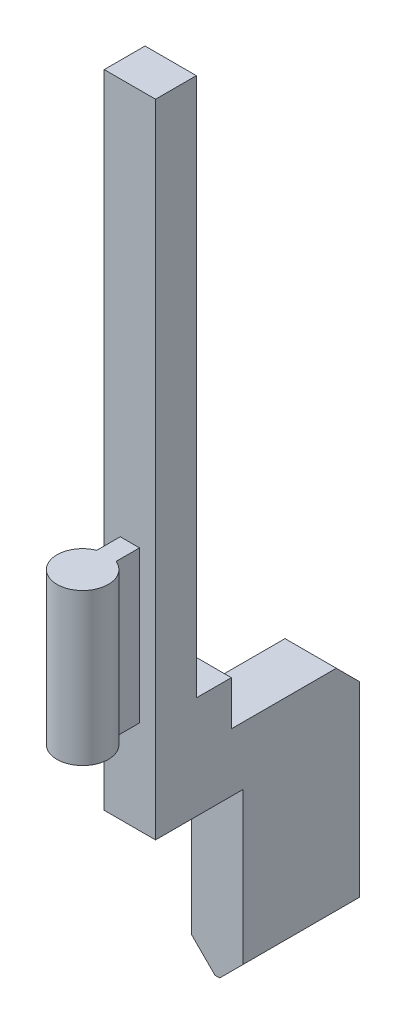
ISO-10303-21;
HEADER;
FILE_DESCRIPTION(('STEP AP214'),'2;1');
FILE_NAME('part.step','',(''),(''),'','','');
FILE_SCHEMA(('AUTOMOTIVE_DESIGN { 1 0 10303 214 1 1 1 1 }'));
ENDSEC;
DATA;
#1=APPLICATION_CONTEXT('core data for automotive mechanical design processes');
#2=APPLICATION_PROTOCOL_DEFINITION('international standard','automotive_design',2000,#1);
#3=PRODUCT_CONTEXT('',#1,'mechanical');
#4=PRODUCT('Part','Part','',(#3));
#5=PRODUCT_RELATED_PRODUCT_CATEGORY('part','',(#4));
#6=PRODUCT_DEFINITION_FORMATION('','',#4);
#7=PRODUCT_DEFINITION_CONTEXT('part definition',#1,'design');
#8=PRODUCT_DEFINITION('design','',#6,#7);
#9=PRODUCT_DEFINITION_SHAPE('','',#8);
#10=(LENGTH_UNIT() NAMED_UNIT(*) SI_UNIT(.MILLI.,.METRE.));
#11=(NAMED_UNIT(*) PLANE_ANGLE_UNIT() SI_UNIT($,.RADIAN.));
#12=(NAMED_UNIT(*) SI_UNIT($,.STERADIAN.) SOLID_ANGLE_UNIT());
#13=UNCERTAINTY_MEASURE_WITH_UNIT(LENGTH_MEASURE(1.E-05),#10,'distance_accuracy_value','');
#14=(GEOMETRIC_REPRESENTATION_CONTEXT(3) GLOBAL_UNCERTAINTY_ASSIGNED_CONTEXT((#13)) GLOBAL_UNIT_ASSIGNED_CONTEXT((#10,
#11,#12)) REPRESENTATION_CONTEXT('',''));
#15=CARTESIAN_POINT('',(0.,0.,0.));
#16=DIRECTION('',(0.,0.,1.));
#17=DIRECTION('',(1.,0.,0.));
#18=AXIS2_PLACEMENT_3D('',#15,#16,#17);
#19=CARTESIAN_POINT('',(-2.2,10.5,6.5));
#20=DIRECTION('',(0.,-1.,0.));
#21=DIRECTION('',(0.,0.,-1.));
#22=AXIS2_PLACEMENT_3D('',#19,#20,#21);
#23=PLANE('',#22);
#24=DIRECTION('',(1.,0.,0.));
#25=VECTOR('',#24,1.);
#26=CARTESIAN_POINT('',(-2.2,10.5,6.5));
#27=LINE('',#26,#25);
#28=CARTESIAN_POINT('',(-0.825000000000007,10.5,6.5));
#29=VERTEX_POINT('',#28);
#30=CARTESIAN_POINT('',(0.825,10.5,6.5));
#31=VERTEX_POINT('',#30);
#32=EDGE_CURVE('E11',#29,#31,#27,.T.);
#33=ORIENTED_EDGE('',*,*,#32,.F.);
#34=DIRECTION('',(0.,0.,1.));
#35=VECTOR('',#34,1.);
#36=CARTESIAN_POINT('',(-0.825000000000032,10.5,0.));
#37=LINE('',#36,#35);
#38=CARTESIAN_POINT('',(-0.824999999999999,10.5,8.5105454160487));
#39=VERTEX_POINT('',#38);
#40=EDGE_CURVE('E240',#29,#39,#37,.T.);
#41=ORIENTED_EDGE('',*,*,#40,.T.);
#42=CARTESIAN_POINT('',(0.,10.5,10.55));
#43=DIRECTION('',(0.,1.,0.));
#44=DIRECTION('',(0.,0.,1.));
#45=AXIS2_PLACEMENT_3D('',#42,#43,#44);
#46=CIRCLE('',#45,2.19999999999999);
#47=CARTESIAN_POINT('',(0.825,10.5,8.51054541604871));
#48=VERTEX_POINT('',#47);
#49=EDGE_CURVE('E235',#39,#48,#46,.T.);
#50=ORIENTED_EDGE('',*,*,#49,.T.);
#51=DIRECTION('',(0.,0.,1.));
#52=VECTOR('',#51,1.);
#53=CARTESIAN_POINT('',(0.824999999999969,10.5,0.));
#54=LINE('',#53,#52);
#55=EDGE_CURVE('E250',#31,#48,#54,.T.);
#56=ORIENTED_EDGE('',*,*,#55,.F.);
#57=EDGE_LOOP('',(#33,#41,#50,#56));
#58=FACE_BOUND('',#57,.T.);
#59=ADVANCED_FACE('F43',(#58),#23,.F.);
#60=CARTESIAN_POINT('',(0.,0.,0.));
#61=DIRECTION('',(0.,0.,1.));
#62=DIRECTION('',(1.,0.,0.));
#63=AXIS2_PLACEMENT_3D('',#60,#61,#62);
#64=PLANE('',#63);
#65=DIRECTION('',(-1.,0.,0.));
#66=VECTOR('',#65,1.);
#67=CARTESIAN_POINT('',(-2.2,-1.7,0.));
#68=LINE('',#67,#66);
#69=CARTESIAN_POINT('',(2.2,-1.7,0.));
#70=VERTEX_POINT('',#69);
#71=CARTESIAN_POINT('',(-2.2,-1.69999999999999,0.));
#72=VERTEX_POINT('',#71);
#73=EDGE_CURVE('E60',#70,#72,#68,.T.);
#74=ORIENTED_EDGE('',*,*,#73,.F.);
#75=DIRECTION('',(0.,1.,0.));
#76=VECTOR('',#75,1.);
#77=CARTESIAN_POINT('',(2.2,10.5,0.));
#78=LINE('',#77,#76);
#79=CARTESIAN_POINT('',(2.2,-5.5,0.));
#80=VERTEX_POINT('',#79);
#81=EDGE_CURVE('E257',#80,#70,#78,.T.);
#82=ORIENTED_EDGE('',*,*,#81,.F.);
#83=DIRECTION('',(1.,0.,0.));
#84=VECTOR('',#83,1.);
#85=CARTESIAN_POINT('',(2.2,-5.5,0.));
#86=LINE('',#85,#84);
#87=CARTESIAN_POINT('',(-2.2,-5.49999999999999,0.));
#88=VERTEX_POINT('',#87);
#89=EDGE_CURVE('E221',#88,#80,#86,.T.);
#90=ORIENTED_EDGE('',*,*,#89,.F.);
#91=DIRECTION('',(0.,-1.,0.));
#92=VECTOR('',#91,1.);
#93=CARTESIAN_POINT('',(-2.2,10.5,0.));
#94=LINE('',#93,#92);
#95=EDGE_CURVE('E265',#72,#88,#94,.T.);
#96=ORIENTED_EDGE('',*,*,#95,.F.);
#97=EDGE_LOOP('',(#74,#82,#90,#96));
#98=FACE_BOUND('',#97,.T.);
#99=ADVANCED_FACE('F332',(#98),#64,.F.);
#100=CARTESIAN_POINT('',(-2.2,-10.5,6.5));
#101=DIRECTION('',(0.,1.,0.));
#102=DIRECTION('',(0.,0.,1.));
#103=AXIS2_PLACEMENT_3D('',#100,#101,#102);
#104=PLANE('',#103);
#105=DIRECTION('',(-1.,0.,0.));
#106=VECTOR('',#105,1.);
#107=CARTESIAN_POINT('',(2.2,-10.5,-1.));
#108=LINE('',#107,#106);
#109=CARTESIAN_POINT('',(2.2,-10.5,-0.999999999999998));
#110=VERTEX_POINT('',#109);
#111=CARTESIAN_POINT('',(-2.2,-10.5,-1.));
#112=VERTEX_POINT('',#111);
#113=EDGE_CURVE('E208',#110,#112,#108,.T.);
#114=ORIENTED_EDGE('',*,*,#113,.F.);
#115=DIRECTION('',(0.,0.,-1.));
#116=VECTOR('',#115,1.);
#117=CARTESIAN_POINT('',(2.2,-10.5,6.5));
#118=LINE('',#117,#116);
#119=CARTESIAN_POINT('',(2.2,-10.5,6.5));
#120=VERTEX_POINT('',#119);
#121=EDGE_CURVE('E268',#120,#110,#118,.T.);
#122=ORIENTED_EDGE('',*,*,#121,.F.);
#123=DIRECTION('',(1.,0.,0.));
#124=VECTOR('',#123,1.);
#125=CARTESIAN_POINT('',(-2.2,-10.5,6.5));
#126=LINE('',#125,#124);
#127=CARTESIAN_POINT('',(-2.2,-10.5,6.5));
#128=VERTEX_POINT('',#127);
#129=EDGE_CURVE('E176',#128,#120,#126,.T.);
#130=ORIENTED_EDGE('',*,*,#129,.F.);
#131=DIRECTION('',(0.,0.,-1.));
#132=VECTOR('',#131,1.);
#133=CARTESIAN_POINT('',(-2.2,-10.5,6.5));
#134=LINE('',#133,#132);
#135=EDGE_CURVE('E173',#128,#112,#134,.T.);
#136=ORIENTED_EDGE('',*,*,#135,.T.);
#137=EDGE_LOOP('',(#114,#122,#130,#136));
#138=FACE_BOUND('',#137,.T.);
#139=ADVANCED_FACE('F353',(#138),#104,.F.);
#140=CARTESIAN_POINT('',(2.2,10.5,6.5));
#141=DIRECTION('',(-1.,0.,0.));
#142=DIRECTION('',(0.,-1.,0.));
#143=AXIS2_PLACEMENT_3D('',#140,#141,#142);
#144=PLANE('',#143);
#145=DIRECTION('',(0.,0.,-1.));
#146=VECTOR('',#145,1.);
#147=CARTESIAN_POINT('',(2.2,-1.7,0.));
#148=LINE('',#147,#146);
#149=CARTESIAN_POINT('',(2.2,-1.7,3.));
#150=VERTEX_POINT('',#149);
#151=EDGE_CURVE('E202',#150,#70,#148,.T.);
#152=ORIENTED_EDGE('',*,*,#151,.F.);
#153=DIRECTION('',(0.,1.,0.));
#154=VECTOR('',#153,1.);
#155=CARTESIAN_POINT('',(2.2,-1.7,3.));
#156=LINE('',#155,#154);
#157=CARTESIAN_POINT('',(2.2,44.5,3.));
#158=VERTEX_POINT('',#157);
#159=EDGE_CURVE('E206',#150,#158,#156,.T.);
#160=ORIENTED_EDGE('',*,*,#159,.T.);
#161=DIRECTION('',(0.,0.,-1.));
#162=VECTOR('',#161,1.);
#163=CARTESIAN_POINT('',(2.2,44.5,3.));
#164=LINE('',#163,#162);
#165=CARTESIAN_POINT('',(2.2,44.5,6.5));
#166=VERTEX_POINT('',#165);
#167=EDGE_CURVE('E187',#166,#158,#164,.T.);
#168=ORIENTED_EDGE('',*,*,#167,.F.);
#169=DIRECTION('',(0.,1.,0.));
#170=VECTOR('',#169,1.);
#171=CARTESIAN_POINT('',(2.2,10.5,6.5));
#172=LINE('',#171,#170);
#173=EDGE_CURVE('E177',#120,#166,#172,.T.);
#174=ORIENTED_EDGE('',*,*,#173,.F.);
#175=ORIENTED_EDGE('',*,*,#121,.T.);
#176=DIRECTION('',(0.,1.,0.));
#177=VECTOR('',#176,1.);
#178=CARTESIAN_POINT('',(2.2,-25.5,-1.));
#179=LINE('',#178,#177);
#180=CARTESIAN_POINT('',(2.2,-23.5,-1.));
#181=VERTEX_POINT('',#180);
#182=EDGE_CURVE('E219',#181,#110,#179,.T.);
#183=ORIENTED_EDGE('',*,*,#182,.F.);
#184=DIRECTION('',(0.,0.,-1.));
#185=VECTOR('',#184,1.);
#186=CARTESIAN_POINT('',(2.2,-23.5,-11.));
#187=LINE('',#186,#185);
#188=CARTESIAN_POINT('',(2.2,-23.5,-11.));
#189=VERTEX_POINT('',#188);
#190=EDGE_CURVE('E282',#181,#189,#187,.T.);
#191=ORIENTED_EDGE('',*,*,#190,.T.);
#192=DIRECTION('',(0.,-1.,0.));
#193=VECTOR('',#192,1.);
#194=CARTESIAN_POINT('',(2.2,-5.5,-11.));
#195=LINE('',#194,#193);
#196=CARTESIAN_POINT('',(2.2,-7.5,-11.));
#197=VERTEX_POINT('',#196);
#198=EDGE_CURVE('E222',#197,#189,#195,.T.);
#199=ORIENTED_EDGE('',*,*,#198,.F.);
#200=DIRECTION('',(0.,0.707106781186546,0.707106781186549));
#201=VECTOR('',#200,1.);
#202=CARTESIAN_POINT('',(2.2,-7.5,-11.));
#203=LINE('',#202,#201);
#204=CARTESIAN_POINT('',(2.2,-5.5,-8.99999999999999));
#205=VERTEX_POINT('',#204);
#206=EDGE_CURVE('E284',#197,#205,#203,.T.);
#207=ORIENTED_EDGE('',*,*,#206,.T.);
#208=DIRECTION('',(0.,0.,1.));
#209=VECTOR('',#208,1.);
#210=CARTESIAN_POINT('',(2.2,-5.5,-11.));
#211=LINE('',#210,#209);
#212=EDGE_CURVE('E228',#205,#80,#211,.T.);
#213=ORIENTED_EDGE('',*,*,#212,.T.);
#214=ORIENTED_EDGE('',*,*,#81,.T.);
#215=EDGE_LOOP('',(#152,#160,#168,#174,#175,#183,#191,#199,#207,#213,#214));
#216=FACE_BOUND('',#215,.T.);
#217=ADVANCED_FACE('F305',(#216),#144,.F.);
#218=CARTESIAN_POINT('',(-2.2,10.5,6.5));
#219=DIRECTION('',(1.,0.,0.));
#220=DIRECTION('',(0.,1.,0.));
#221=AXIS2_PLACEMENT_3D('',#218,#219,#220);
#222=PLANE('',#221);
#223=DIRECTION('',(0.,-1.,0.));
#224=VECTOR('',#223,1.);
#225=CARTESIAN_POINT('',(-2.2,10.5,6.5));
#226=LINE('',#225,#224);
#227=CARTESIAN_POINT('',(-2.2,44.5,6.5));
#228=VERTEX_POINT('',#227);
#229=EDGE_CURVE('E166',#228,#128,#226,.T.);
#230=ORIENTED_EDGE('',*,*,#229,.F.);
#231=DIRECTION('',(0.,0.,1.));
#232=VECTOR('',#231,1.);
#233=CARTESIAN_POINT('',(-2.2,44.5,3.));
#234=LINE('',#233,#232);
#235=CARTESIAN_POINT('',(-2.2,44.5,3.));
#236=VERTEX_POINT('',#235);
#237=EDGE_CURVE('E171',#236,#228,#234,.T.);
#238=ORIENTED_EDGE('',*,*,#237,.F.);
#239=DIRECTION('',(0.,1.,0.));
#240=VECTOR('',#239,1.);
#241=CARTESIAN_POINT('',(-2.2,-1.7,3.));
#242=LINE('',#241,#240);
#243=CARTESIAN_POINT('',(-2.2,-1.7,3.));
#244=VERTEX_POINT('',#243);
#245=EDGE_CURVE('E205',#244,#236,#242,.T.);
#246=ORIENTED_EDGE('',*,*,#245,.F.);
#247=DIRECTION('',(0.,0.,1.));
#248=VECTOR('',#247,1.);
#249=CARTESIAN_POINT('',(-2.2,-1.7,0.));
#250=LINE('',#249,#248);
#251=EDGE_CURVE('E196',#72,#244,#250,.T.);
#252=ORIENTED_EDGE('',*,*,#251,.F.);
#253=ORIENTED_EDGE('',*,*,#95,.T.);
#254=DIRECTION('',(0.,0.,1.));
#255=VECTOR('',#254,1.);
#256=CARTESIAN_POINT('',(-2.2,-5.5,-11.));
#257=LINE('',#256,#255);
#258=CARTESIAN_POINT('',(-2.2,-5.5,-8.99999999999999));
#259=VERTEX_POINT('',#258);
#260=EDGE_CURVE('E232',#259,#88,#257,.T.);
#261=ORIENTED_EDGE('',*,*,#260,.F.);
#262=DIRECTION('',(0.,-0.707106781186546,-0.707106781186549));
#263=VECTOR('',#262,1.);
#264=CARTESIAN_POINT('',(-2.2,-7.5,-11.));
#265=LINE('',#264,#263);
#266=CARTESIAN_POINT('',(-2.2,-7.5,-11.));
#267=VERTEX_POINT('',#266);
#268=EDGE_CURVE('E290',#259,#267,#265,.T.);
#269=ORIENTED_EDGE('',*,*,#268,.T.);
#270=DIRECTION('',(0.,1.,0.));
#271=VECTOR('',#270,1.);
#272=CARTESIAN_POINT('',(-2.2,-5.5,-11.));
#273=LINE('',#272,#271);
#274=CARTESIAN_POINT('',(-2.2,-23.5,-11.));
#275=VERTEX_POINT('',#274);
#276=EDGE_CURVE('E225',#275,#267,#273,.T.);
#277=ORIENTED_EDGE('',*,*,#276,.F.);
#278=DIRECTION('',(0.,0.,1.));
#279=VECTOR('',#278,1.);
#280=CARTESIAN_POINT('',(-2.2,-23.5,-1.));
#281=LINE('',#280,#279);
#282=CARTESIAN_POINT('',(-2.2,-23.5,-1.));
#283=VERTEX_POINT('',#282);
#284=EDGE_CURVE('E288',#275,#283,#281,.T.);
#285=ORIENTED_EDGE('',*,*,#284,.T.);
#286=DIRECTION('',(0.,1.,0.));
#287=VECTOR('',#286,1.);
#288=CARTESIAN_POINT('',(-2.2,-25.5,-1.));
#289=LINE('',#288,#287);
#290=EDGE_CURVE('E215',#283,#112,#289,.T.);
#291=ORIENTED_EDGE('',*,*,#290,.T.);
#292=ORIENTED_EDGE('',*,*,#135,.F.);
#293=EDGE_LOOP('',(#230,#238,#246,#252,#253,#261,#269,#277,#285,#291,#292));
#294=FACE_BOUND('',#293,.T.);
#295=ADVANCED_FACE('F168',(#294),#222,.F.);
#296=CARTESIAN_POINT('',(0.,0.,6.5));
#297=DIRECTION('',(0.,0.,1.));
#298=DIRECTION('',(1.,0.,0.));
#299=AXIS2_PLACEMENT_3D('',#296,#297,#298);
#300=PLANE('',#299);
#301=DIRECTION('',(1.,0.,0.));
#302=VECTOR('',#301,1.);
#303=CARTESIAN_POINT('',(-2.2,44.5,6.5));
#304=LINE('',#303,#302);
#305=EDGE_CURVE('E180',#228,#166,#304,.T.);
#306=ORIENTED_EDGE('',*,*,#305,.F.);
#307=ORIENTED_EDGE('',*,*,#229,.T.);
#308=ORIENTED_EDGE('',*,*,#129,.T.);
#309=ORIENTED_EDGE('',*,*,#173,.T.);
#310=EDGE_LOOP('',(#306,#307,#308,#309));
#311=FACE_BOUND('',#310,.T.);
#312=DIRECTION('',(0.,1.,0.));
#313=VECTOR('',#312,1.);
#314=CARTESIAN_POINT('',(0.825,-2.5,6.5));
#315=LINE('',#314,#313);
#316=CARTESIAN_POINT('',(0.825,-2.5,6.5));
#317=VERTEX_POINT('',#316);
#318=EDGE_CURVE('E261',#317,#31,#315,.T.);
#319=ORIENTED_EDGE('',*,*,#318,.F.);
#320=DIRECTION('',(1.,0.,0.));
#321=VECTOR('',#320,1.);
#322=CARTESIAN_POINT('',(0.,-2.5,6.5));
#323=LINE('',#322,#321);
#324=CARTESIAN_POINT('',(-0.825000000000007,-2.5,6.5));
#325=VERTEX_POINT('',#324);
#326=EDGE_CURVE('E242',#325,#317,#323,.T.);
#327=ORIENTED_EDGE('',*,*,#326,.F.);
#328=DIRECTION('',(0.,1.,0.));
#329=VECTOR('',#328,1.);
#330=CARTESIAN_POINT('',(-0.825000000000007,-2.5,6.5));
#331=LINE('',#330,#329);
#332=EDGE_CURVE('E258',#325,#29,#331,.T.);
#333=ORIENTED_EDGE('',*,*,#332,.T.);
#334=ORIENTED_EDGE('',*,*,#32,.T.);
#335=EDGE_LOOP('',(#319,#327,#333,#334));
#336=FACE_BOUND('',#335,.T.);
#337=ADVANCED_FACE('F181',(#311,#336),#300,.T.);
#338=CARTESIAN_POINT('',(0.,-2.5,10.55));
#339=DIRECTION('',(0.,1.,0.));
#340=DIRECTION('',(0.,0.,1.));
#341=AXIS2_PLACEMENT_3D('',#338,#339,#340);
#342=CYLINDRICAL_SURFACE('',#341,2.19999999999999);
#343=ORIENTED_EDGE('',*,*,#49,.F.);
#344=DIRECTION('',(0.,1.,0.));
#345=VECTOR('',#344,1.);
#346=CARTESIAN_POINT('',(-0.824999999999999,-2.5,8.5105454160487));
#347=LINE('',#346,#345);
#348=CARTESIAN_POINT('',(-0.824999999999999,-2.5,8.5105454160487));
#349=VERTEX_POINT('',#348);
#350=EDGE_CURVE('E255',#349,#39,#347,.T.);
#351=ORIENTED_EDGE('',*,*,#350,.F.);
#352=CARTESIAN_POINT('',(0.,-2.5,10.55));
#353=DIRECTION('',(0.,1.,0.));
#354=DIRECTION('',(0.,0.,1.));
#355=AXIS2_PLACEMENT_3D('',#352,#353,#354);
#356=CIRCLE('',#355,2.19999999999999);
#357=CARTESIAN_POINT('',(0.825,-2.5,8.51054541604871));
#358=VERTEX_POINT('',#357);
#359=EDGE_CURVE('E236',#349,#358,#356,.T.);
#360=ORIENTED_EDGE('',*,*,#359,.T.);
#361=DIRECTION('',(0.,1.,0.));
#362=VECTOR('',#361,1.);
#363=CARTESIAN_POINT('',(0.825,-2.5,8.51054541604871));
#364=LINE('',#363,#362);
#365=EDGE_CURVE('E247',#358,#48,#364,.T.);
#366=ORIENTED_EDGE('',*,*,#365,.T.);
#367=EDGE_LOOP('',(#343,#351,#360,#366));
#368=FACE_BOUND('',#367,.T.);
#369=ADVANCED_FACE('F430',(#368),#342,.T.);
#370=CARTESIAN_POINT('',(-0.825000000000032,-2.5,0.));
#371=DIRECTION('',(-1.,0.,0.));
#372=DIRECTION('',(0.,0.,1.));
#373=AXIS2_PLACEMENT_3D('',#370,#371,#372);
#374=PLANE('',#373);
#375=ORIENTED_EDGE('',*,*,#40,.F.);
#376=ORIENTED_EDGE('',*,*,#332,.F.);
#377=DIRECTION('',(0.,0.,1.));
#378=VECTOR('',#377,1.);
#379=CARTESIAN_POINT('',(-0.825000000000032,-2.5,0.));
#380=LINE('',#379,#378);
#381=EDGE_CURVE('E244',#325,#349,#380,.T.);
#382=ORIENTED_EDGE('',*,*,#381,.T.);
#383=ORIENTED_EDGE('',*,*,#350,.T.);
#384=EDGE_LOOP('',(#375,#376,#382,#383));
#385=FACE_BOUND('',#384,.T.);
#386=ADVANCED_FACE('F447',(#385),#374,.T.);
#387=CARTESIAN_POINT('',(0.824999999999969,-2.5,0.));
#388=DIRECTION('',(-1.,0.,0.));
#389=DIRECTION('',(0.,0.,1.));
#390=AXIS2_PLACEMENT_3D('',#387,#388,#389);
#391=PLANE('',#390);
#392=ORIENTED_EDGE('',*,*,#55,.T.);
#393=ORIENTED_EDGE('',*,*,#365,.F.);
#394=DIRECTION('',(0.,0.,1.));
#395=VECTOR('',#394,1.);
#396=CARTESIAN_POINT('',(0.824999999999969,-2.5,0.));
#397=LINE('',#396,#395);
#398=EDGE_CURVE('E239',#317,#358,#397,.T.);
#399=ORIENTED_EDGE('',*,*,#398,.F.);
#400=ORIENTED_EDGE('',*,*,#318,.T.);
#401=EDGE_LOOP('',(#392,#393,#399,#400));
#402=FACE_BOUND('',#401,.T.);
#403=ADVANCED_FACE('F450',(#402),#391,.F.);
#404=CARTESIAN_POINT('',(0.,-2.5,0.));
#405=DIRECTION('',(0.,1.,0.));
#406=DIRECTION('',(0.,0.,1.));
#407=AXIS2_PLACEMENT_3D('',#404,#405,#406);
#408=PLANE('',#407);
#409=ORIENTED_EDGE('',*,*,#359,.F.);
#410=ORIENTED_EDGE('',*,*,#381,.F.);
#411=ORIENTED_EDGE('',*,*,#326,.T.);
#412=ORIENTED_EDGE('',*,*,#398,.T.);
#413=EDGE_LOOP('',(#409,#410,#411,#412));
#414=FACE_BOUND('',#413,.T.);
#415=ADVANCED_FACE('F458',(#414),#408,.F.);
#416=CARTESIAN_POINT('',(2.2,-5.5,-11.));
#417=DIRECTION('',(0.,-1.,0.));
#418=DIRECTION('',(0.,0.,-1.));
#419=AXIS2_PLACEMENT_3D('',#416,#417,#418);
#420=PLANE('',#419);
#421=ORIENTED_EDGE('',*,*,#212,.F.);
#422=DIRECTION('',(-1.,0.,0.));
#423=VECTOR('',#422,1.);
#424=CARTESIAN_POINT('',(-2.2,-5.5,-8.99999999999999));
#425=LINE('',#424,#423);
#426=EDGE_CURVE('E286',#205,#259,#425,.T.);
#427=ORIENTED_EDGE('',*,*,#426,.T.);
#428=ORIENTED_EDGE('',*,*,#260,.T.);
#429=ORIENTED_EDGE('',*,*,#89,.T.);
#430=EDGE_LOOP('',(#421,#427,#428,#429));
#431=FACE_BOUND('',#430,.T.);
#432=ADVANCED_FACE('F328',(#431),#420,.F.);
#433=CARTESIAN_POINT('',(0.,0.,-11.));
#434=DIRECTION('',(0.,0.,-1.));
#435=DIRECTION('',(-1.,0.,0.));
#436=AXIS2_PLACEMENT_3D('',#433,#434,#435);
#437=PLANE('',#436);
#438=ORIENTED_EDGE('',*,*,#276,.T.);
#439=DIRECTION('',(1.,0.,0.));
#440=VECTOR('',#439,1.);
#441=CARTESIAN_POINT('',(2.2,-7.5,-11.));
#442=LINE('',#441,#440);
#443=EDGE_CURVE('E279',#267,#197,#442,.T.);
#444=ORIENTED_EDGE('',*,*,#443,.T.);
#445=ORIENTED_EDGE('',*,*,#198,.T.);
#446=DIRECTION('',(-0.707106781186546,-0.707106781186549,0.));
#447=VECTOR('',#446,1.);
#448=CARTESIAN_POINT('',(12.85,-12.8499999999999,-11.));
#449=LINE('',#448,#447);
#450=CARTESIAN_POINT('',(0.200000000000008,-25.5,-11.));
#451=VERTEX_POINT('',#450);
#452=EDGE_CURVE('E277',#189,#451,#449,.T.);
#453=ORIENTED_EDGE('',*,*,#452,.T.);
#454=DIRECTION('',(1.,0.,0.));
#455=VECTOR('',#454,1.);
#456=CARTESIAN_POINT('',(2.2,-25.5,-11.));
#457=LINE('',#456,#455);
#458=CARTESIAN_POINT('',(-0.200000000000006,-25.5,-11.));
#459=VERTEX_POINT('',#458);
#460=EDGE_CURVE('E212',#459,#451,#457,.T.);
#461=ORIENTED_EDGE('',*,*,#460,.F.);
#462=DIRECTION('',(-0.707106781186546,0.707106781186549,0.));
#463=VECTOR('',#462,1.);
#464=CARTESIAN_POINT('',(-12.85,-12.85,-11.));
#465=LINE('',#464,#463);
#466=EDGE_CURVE('E275',#459,#275,#465,.T.);
#467=ORIENTED_EDGE('',*,*,#466,.T.);
#468=EDGE_LOOP('',(#438,#444,#445,#453,#461,#467));
#469=FACE_BOUND('',#468,.T.);
#470=ADVANCED_FACE('F312',(#469),#437,.T.);
#471=CARTESIAN_POINT('',(2.2,-25.5,-1.));
#472=DIRECTION('',(0.,0.,-1.));
#473=DIRECTION('',(-1.,0.,0.));
#474=AXIS2_PLACEMENT_3D('',#471,#472,#473);
#475=PLANE('',#474);
#476=DIRECTION('',(-1.,0.,0.));
#477=VECTOR('',#476,1.);
#478=CARTESIAN_POINT('',(2.2,-25.5,-1.));
#479=LINE('',#478,#477);
#480=CARTESIAN_POINT('',(0.200000000000008,-25.5,-1.));
#481=VERTEX_POINT('',#480);
#482=CARTESIAN_POINT('',(-0.200000000000006,-25.5,-1.));
#483=VERTEX_POINT('',#482);
#484=EDGE_CURVE('E210',#481,#483,#479,.T.);
#485=ORIENTED_EDGE('',*,*,#484,.F.);
#486=DIRECTION('',(0.707106781186546,0.707106781186549,0.));
#487=VECTOR('',#486,1.);
#488=CARTESIAN_POINT('',(0.200000000000008,-25.5,-1.));
#489=LINE('',#488,#487);
#490=EDGE_CURVE('E48',#481,#181,#489,.T.);
#491=ORIENTED_EDGE('',*,*,#490,.T.);
#492=ORIENTED_EDGE('',*,*,#182,.T.);
#493=ORIENTED_EDGE('',*,*,#113,.T.);
#494=ORIENTED_EDGE('',*,*,#290,.F.);
#495=DIRECTION('',(0.707106781186546,-0.707106781186549,0.));
#496=VECTOR('',#495,1.);
#497=CARTESIAN_POINT('',(-0.200000000000006,-25.5,-1.));
#498=LINE('',#497,#496);
#499=EDGE_CURVE('E68',#283,#483,#498,.T.);
#500=ORIENTED_EDGE('',*,*,#499,.T.);
#501=EDGE_LOOP('',(#485,#491,#492,#493,#494,#500));
#502=FACE_BOUND('',#501,.T.);
#503=ADVANCED_FACE('F298',(#502),#475,.F.);
#504=CARTESIAN_POINT('',(0.,-25.5,0.));
#505=DIRECTION('',(0.,-1.,0.));
#506=DIRECTION('',(0.,0.,-1.));
#507=AXIS2_PLACEMENT_3D('',#504,#505,#506);
#508=PLANE('',#507);
#509=ORIENTED_EDGE('',*,*,#460,.T.);
#510=DIRECTION('',(0.,0.,1.));
#511=VECTOR('',#510,1.);
#512=CARTESIAN_POINT('',(0.200000000000008,-25.5,-1.));
#513=LINE('',#512,#511);
#514=EDGE_CURVE('E295',#451,#481,#513,.T.);
#515=ORIENTED_EDGE('',*,*,#514,.T.);
#516=ORIENTED_EDGE('',*,*,#484,.T.);
#517=DIRECTION('',(0.,0.,-1.));
#518=VECTOR('',#517,1.);
#519=CARTESIAN_POINT('',(-0.200000000000006,-25.5,-11.));
#520=LINE('',#519,#518);
#521=EDGE_CURVE('E292',#483,#459,#520,.T.);
#522=ORIENTED_EDGE('',*,*,#521,.T.);
#523=EDGE_LOOP('',(#509,#515,#516,#522));
#524=FACE_BOUND('',#523,.T.);
#525=ADVANCED_FACE('F314',(#524),#508,.T.);
#526=CARTESIAN_POINT('',(0.,-7.5,-11.));
#527=DIRECTION('',(0.,0.707106781186549,-0.707106781186546));
#528=DIRECTION('',(-1.,0.,0.));
#529=AXIS2_PLACEMENT_3D('',#526,#527,#528);
#530=PLANE('',#529);
#531=ORIENTED_EDGE('',*,*,#268,.F.);
#532=ORIENTED_EDGE('',*,*,#426,.F.);
#533=ORIENTED_EDGE('',*,*,#206,.F.);
#534=ORIENTED_EDGE('',*,*,#443,.F.);
#535=EDGE_LOOP('',(#531,#532,#533,#534));
#536=FACE_BOUND('',#535,.T.);
#537=ADVANCED_FACE('F324',(#536),#530,.T.);
#538=CARTESIAN_POINT('',(0.200000000000008,-25.5,0.));
#539=DIRECTION('',(0.707106781186549,-0.707106781186546,0.));
#540=DIRECTION('',(0.,0.,-1.));
#541=AXIS2_PLACEMENT_3D('',#538,#539,#540);
#542=PLANE('',#541);
#543=ORIENTED_EDGE('',*,*,#452,.F.);
#544=ORIENTED_EDGE('',*,*,#190,.F.);
#545=ORIENTED_EDGE('',*,*,#490,.F.);
#546=ORIENTED_EDGE('',*,*,#514,.F.);
#547=EDGE_LOOP('',(#543,#544,#545,#546));
#548=FACE_BOUND('',#547,.T.);
#549=ADVANCED_FACE('F309',(#548),#542,.T.);
#550=CARTESIAN_POINT('',(-0.200000000000006,-25.5,0.));
#551=DIRECTION('',(-0.707106781186549,-0.707106781186546,0.));
#552=DIRECTION('',(0.,0.,1.));
#553=AXIS2_PLACEMENT_3D('',#550,#551,#552);
#554=PLANE('',#553);
#555=ORIENTED_EDGE('',*,*,#499,.F.);
#556=ORIENTED_EDGE('',*,*,#284,.F.);
#557=ORIENTED_EDGE('',*,*,#466,.F.);
#558=ORIENTED_EDGE('',*,*,#521,.F.);
#559=EDGE_LOOP('',(#555,#556,#557,#558));
#560=FACE_BOUND('',#559,.T.);
#561=ADVANCED_FACE('F46',(#560),#554,.T.);
#562=CARTESIAN_POINT('',(-2.2,-1.7,3.));
#563=DIRECTION('',(0.,0.,1.));
#564=DIRECTION('',(1.,0.,0.));
#565=AXIS2_PLACEMENT_3D('',#562,#563,#564);
#566=PLANE('',#565);
#567=ORIENTED_EDGE('',*,*,#245,.T.);
#568=DIRECTION('',(-1.,0.,0.));
#569=VECTOR('',#568,1.);
#570=CARTESIAN_POINT('',(-2.2,44.5,3.));
#571=LINE('',#570,#569);
#572=EDGE_CURVE('E192',#158,#236,#571,.T.);
#573=ORIENTED_EDGE('',*,*,#572,.F.);
#574=ORIENTED_EDGE('',*,*,#159,.F.);
#575=DIRECTION('',(1.,0.,0.));
#576=VECTOR('',#575,1.);
#577=CARTESIAN_POINT('',(-2.2,-1.7,3.));
#578=LINE('',#577,#576);
#579=EDGE_CURVE('E199',#244,#150,#578,.T.);
#580=ORIENTED_EDGE('',*,*,#579,.F.);
#581=EDGE_LOOP('',(#567,#573,#574,#580));
#582=FACE_BOUND('',#581,.T.);
#583=ADVANCED_FACE('F335',(#582),#566,.F.);
#584=CARTESIAN_POINT('',(0.,-1.7,0.));
#585=DIRECTION('',(0.,1.,0.));
#586=DIRECTION('',(0.,0.,1.));
#587=AXIS2_PLACEMENT_3D('',#584,#585,#586);
#588=PLANE('',#587);
#589=ORIENTED_EDGE('',*,*,#251,.T.);
#590=ORIENTED_EDGE('',*,*,#579,.T.);
#591=ORIENTED_EDGE('',*,*,#151,.T.);
#592=ORIENTED_EDGE('',*,*,#73,.T.);
#593=EDGE_LOOP('',(#589,#590,#591,#592));
#594=FACE_BOUND('',#593,.T.);
#595=ADVANCED_FACE('F333',(#594),#588,.T.);
#596=CARTESIAN_POINT('',(0.,44.5,0.));
#597=DIRECTION('',(0.,1.,0.));
#598=DIRECTION('',(0.,0.,1.));
#599=AXIS2_PLACEMENT_3D('',#596,#597,#598);
#600=PLANE('',#599);
#601=ORIENTED_EDGE('',*,*,#237,.T.);
#602=ORIENTED_EDGE('',*,*,#305,.T.);
#603=ORIENTED_EDGE('',*,*,#167,.T.);
#604=ORIENTED_EDGE('',*,*,#572,.T.);
#605=EDGE_LOOP('',(#601,#602,#603,#604));
#606=FACE_BOUND('',#605,.T.);
#607=ADVANCED_FACE('F190',(#606),#600,.T.);
#608=CLOSED_SHELL('',(#59,#99,#139,#217,#295,#337,#369,#386,#403,#415,#432,#470,#503,#525,#537,
#549,#561,#583,#595,#607));
#609=MANIFOLD_SOLID_BREP('B2',#608);
#610=ADVANCED_BREP_SHAPE_REPRESENTATION('',(#18,#609),#14);
#611=SHAPE_DEFINITION_REPRESENTATION(#9,#610);
ENDSEC;
END-ISO-10303-21;
